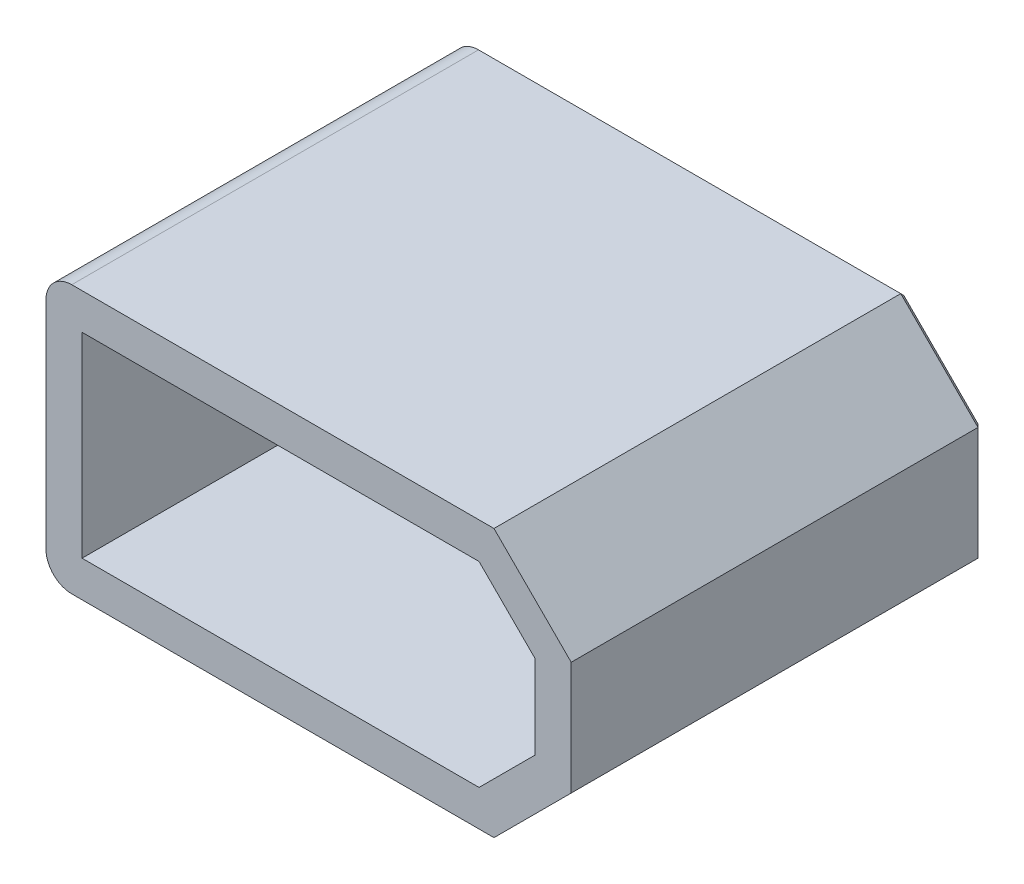
ISO-10303-21;
HEADER;
FILE_DESCRIPTION(('STEP AP214'),'2;1');
FILE_NAME('part.step','',(''),(''),'','','');
FILE_SCHEMA(('AUTOMOTIVE_DESIGN { 1 0 10303 214 1 1 1 1 }'));
ENDSEC;
DATA;
#1=APPLICATION_CONTEXT('core data for automotive mechanical design processes');
#2=APPLICATION_PROTOCOL_DEFINITION('international standard','automotive_design',2000,#1);
#3=PRODUCT_CONTEXT('',#1,'mechanical');
#4=PRODUCT('Part','Part','',(#3));
#5=PRODUCT_RELATED_PRODUCT_CATEGORY('part','',(#4));
#6=PRODUCT_DEFINITION_FORMATION('','',#4);
#7=PRODUCT_DEFINITION_CONTEXT('part definition',#1,'design');
#8=PRODUCT_DEFINITION('design','',#6,#7);
#9=PRODUCT_DEFINITION_SHAPE('','',#8);
#10=(LENGTH_UNIT() NAMED_UNIT(*) SI_UNIT(.MILLI.,.METRE.));
#11=(NAMED_UNIT(*) PLANE_ANGLE_UNIT() SI_UNIT($,.RADIAN.));
#12=(NAMED_UNIT(*) SI_UNIT($,.STERADIAN.) SOLID_ANGLE_UNIT());
#13=UNCERTAINTY_MEASURE_WITH_UNIT(LENGTH_MEASURE(1.E-05),#10,'distance_accuracy_value','');
#14=(GEOMETRIC_REPRESENTATION_CONTEXT(3) GLOBAL_UNCERTAINTY_ASSIGNED_CONTEXT((#13)) GLOBAL_UNIT_ASSIGNED_CONTEXT((#10,
#11,#12)) REPRESENTATION_CONTEXT('',''));
#15=CARTESIAN_POINT('',(0.,0.,0.));
#16=DIRECTION('',(0.,0.,1.));
#17=DIRECTION('',(1.,0.,0.));
#18=AXIS2_PLACEMENT_3D('',#15,#16,#17);
#19=CARTESIAN_POINT('',(-2.5,0.,4.3));
#20=DIRECTION('',(0.,0.,1.));
#21=DIRECTION('',(1.,0.,0.));
#22=AXIS2_PLACEMENT_3D('',#19,#20,#21);
#23=PLANE('',#22);
#24=CARTESIAN_POINT('',(-2.5,0.,4.30000000000064));
#25=DIRECTION('',(0.,0.,-1.));
#26=DIRECTION('',(-1.,0.,0.));
#27=AXIS2_PLACEMENT_3D('',#24,#25,#26);
#28=CIRCLE('',#27,0.899999999942338);
#29=CARTESIAN_POINT('',(-3.39999999994234,0.,4.30000000000064));
#30=VERTEX_POINT('',#29);
#31=EDGE_CURVE('E20',#30,#30,#28,.T.);
#32=ORIENTED_EDGE('',*,*,#31,.F.);
#33=EDGE_LOOP('',(#32));
#34=FACE_BOUND('',#33,.T.);
#35=ADVANCED_FACE('F17',(#34),#23,.T.);
#36=CARTESIAN_POINT('',(2.5,0.,4.3));
#37=DIRECTION('',(0.,0.,1.));
#38=DIRECTION('',(1.,0.,0.));
#39=AXIS2_PLACEMENT_3D('',#36,#37,#38);
#40=PLANE('',#39);
#41=CARTESIAN_POINT('',(2.5,0.,4.30000000005748));
#42=DIRECTION('',(0.,0.,-1.));
#43=DIRECTION('',(-1.,0.,0.));
#44=AXIS2_PLACEMENT_3D('',#41,#42,#43);
#45=CIRCLE('',#44,0.899999999946886);
#46=CARTESIAN_POINT('',(1.60000000005311,0.,4.30000000005748));
#47=VERTEX_POINT('',#46);
#48=EDGE_CURVE('E362',#47,#47,#45,.T.);
#49=ORIENTED_EDGE('',*,*,#48,.F.);
#50=EDGE_LOOP('',(#49));
#51=FACE_BOUND('',#50,.T.);
#52=ADVANCED_FACE('F378',(#51),#40,.T.);
#53=CARTESIAN_POINT('',(-2.5,0.,4.20000000002574));
#54=DIRECTION('',(0.,0.,-1.));
#55=DIRECTION('',(-1.,0.,0.));
#56=AXIS2_PLACEMENT_3D('',#53,#54,#55);
#57=CONICAL_SURFACE('',#56,0.999999999917236,0.785398163397448);
#58=CARTESIAN_POINT('',(-2.5,0.,4.2));
#59=DIRECTION('',(0.,0.,-1.));
#60=DIRECTION('',(-1.,0.,0.));
#61=AXIS2_PLACEMENT_3D('',#58,#59,#60);
#62=CIRCLE('',#61,1.);
#63=CARTESIAN_POINT('',(-3.5,0.,4.2));
#64=VERTEX_POINT('',#63);
#65=EDGE_CURVE('E359',#64,#64,#62,.T.);
#66=ORIENTED_EDGE('',*,*,#65,.F.);
#67=EDGE_LOOP('',(#66));
#68=FACE_BOUND('',#67,.T.);
#69=ORIENTED_EDGE('',*,*,#31,.T.);
#70=EDGE_LOOP('',(#69));
#71=FACE_BOUND('',#70,.T.);
#72=ADVANCED_FACE('F375',(#68,#71),#57,.T.);
#73=CARTESIAN_POINT('',(2.5,0.,4.20000000002574));
#74=DIRECTION('',(0.,0.,-1.));
#75=DIRECTION('',(-1.,0.,0.));
#76=AXIS2_PLACEMENT_3D('',#73,#74,#75);
#77=CONICAL_SURFACE('',#76,0.999999999978627,0.785398163397448);
#78=CARTESIAN_POINT('',(2.5,0.,4.2));
#79=DIRECTION('',(0.,0.,-1.));
#80=DIRECTION('',(-1.,0.,0.));
#81=AXIS2_PLACEMENT_3D('',#78,#79,#80);
#82=CIRCLE('',#81,1.);
#83=CARTESIAN_POINT('',(1.5,0.,4.2));
#84=VERTEX_POINT('',#83);
#85=EDGE_CURVE('E356',#84,#84,#82,.T.);
#86=ORIENTED_EDGE('',*,*,#85,.F.);
#87=EDGE_LOOP('',(#86));
#88=FACE_BOUND('',#87,.T.);
#89=ORIENTED_EDGE('',*,*,#48,.T.);
#90=EDGE_LOOP('',(#89));
#91=FACE_BOUND('',#90,.T.);
#92=ADVANCED_FACE('F488',(#88,#91),#77,.T.);
#93=CARTESIAN_POINT('',(-2.5,0.,4.3));
#94=DIRECTION('',(0.,0.,-1.));
#95=DIRECTION('',(-1.,0.,0.));
#96=AXIS2_PLACEMENT_3D('',#93,#94,#95);
#97=CYLINDRICAL_SURFACE('',#96,1.);
#98=CARTESIAN_POINT('',(-2.5,0.,1.3));
#99=DIRECTION('',(0.,0.,-1.));
#100=DIRECTION('',(-1.,0.,0.));
#101=AXIS2_PLACEMENT_3D('',#98,#99,#100);
#102=CIRCLE('',#101,1.);
#103=CARTESIAN_POINT('',(-3.5,0.,1.3));
#104=VERTEX_POINT('',#103);
#105=EDGE_CURVE('E344',#104,#104,#102,.T.);
#106=ORIENTED_EDGE('',*,*,#105,.F.);
#107=EDGE_LOOP('',(#106));
#108=FACE_BOUND('',#107,.T.);
#109=ORIENTED_EDGE('',*,*,#65,.T.);
#110=EDGE_LOOP('',(#109));
#111=FACE_BOUND('',#110,.T.);
#112=ADVANCED_FACE('F484',(#108,#111),#97,.T.);
#113=CARTESIAN_POINT('',(2.5,0.,4.3));
#114=DIRECTION('',(0.,0.,-1.));
#115=DIRECTION('',(-1.,0.,0.));
#116=AXIS2_PLACEMENT_3D('',#113,#114,#115);
#117=CYLINDRICAL_SURFACE('',#116,1.);
#118=CARTESIAN_POINT('',(2.5,0.,1.3));
#119=DIRECTION('',(0.,0.,-1.));
#120=DIRECTION('',(-1.,0.,0.));
#121=AXIS2_PLACEMENT_3D('',#118,#119,#120);
#122=CIRCLE('',#121,1.);
#123=CARTESIAN_POINT('',(1.5,0.,1.3));
#124=VERTEX_POINT('',#123);
#125=EDGE_CURVE('E339',#124,#124,#122,.T.);
#126=ORIENTED_EDGE('',*,*,#125,.F.);
#127=EDGE_LOOP('',(#126));
#128=FACE_BOUND('',#127,.T.);
#129=ORIENTED_EDGE('',*,*,#85,.T.);
#130=EDGE_LOOP('',(#129));
#131=FACE_BOUND('',#130,.T.);
#132=ADVANCED_FACE('F480',(#128,#131),#117,.T.);
#133=CARTESIAN_POINT('',(4.4,-0.81005050633883,1.3));
#134=DIRECTION('',(1.,0.,0.));
#135=DIRECTION('',(0.,0.,-1.));
#136=AXIS2_PLACEMENT_3D('',#133,#134,#135);
#137=PLANE('',#136);
#138=DIRECTION('',(0.,0.,1.));
#139=VECTOR('',#138,1.);
#140=CARTESIAN_POINT('',(4.4,0.810050506338831,1.3));
#141=LINE('',#140,#139);
#142=CARTESIAN_POINT('',(4.4,0.810050506338831,8.));
#143=VERTEX_POINT('',#142);
#144=CARTESIAN_POINT('',(4.4,0.810050506338831,1.3));
#145=VERTEX_POINT('',#144);
#146=EDGE_CURVE('E348',#143,#145,#141,.F.);
#147=ORIENTED_EDGE('',*,*,#146,.T.);
#148=DIRECTION('',(0.,1.,0.));
#149=VECTOR('',#148,1.);
#150=CARTESIAN_POINT('',(4.4,0.,1.3));
#151=LINE('',#150,#149);
#152=CARTESIAN_POINT('',(4.4,-0.81005050633883,1.3));
#153=VERTEX_POINT('',#152);
#154=EDGE_CURVE('E342',#153,#145,#151,.T.);
#155=ORIENTED_EDGE('',*,*,#154,.F.);
#156=DIRECTION('',(0.,0.,1.));
#157=VECTOR('',#156,1.);
#158=CARTESIAN_POINT('',(4.4,-0.81005050633883,1.3));
#159=LINE('',#158,#157);
#160=CARTESIAN_POINT('',(4.4,-0.81005050633883,8.));
#161=VERTEX_POINT('',#160);
#162=EDGE_CURVE('E333',#153,#161,#159,.T.);
#163=ORIENTED_EDGE('',*,*,#162,.T.);
#164=DIRECTION('',(0.,1.,0.));
#165=VECTOR('',#164,1.);
#166=CARTESIAN_POINT('',(4.4,-0.81005050633883,8.));
#167=LINE('',#166,#165);
#168=EDGE_CURVE('E351',#143,#161,#167,.F.);
#169=ORIENTED_EDGE('',*,*,#168,.F.);
#170=EDGE_LOOP('',(#147,#155,#163,#169));
#171=FACE_BOUND('',#170,.T.);
#172=ADVANCED_FACE('F476',(#171),#137,.F.);
#173=CARTESIAN_POINT('',(4.4,0.810050506338831,1.3));
#174=DIRECTION('',(0.707106781186548,0.707106781186547,0.));
#175=DIRECTION('',(-0.707106781186547,0.707106781186548,0.));
#176=AXIS2_PLACEMENT_3D('',#173,#174,#175);
#177=PLANE('',#176);
#178=DIRECTION('',(0.,0.,1.));
#179=VECTOR('',#178,1.);
#180=CARTESIAN_POINT('',(3.31005050633883,1.9,1.3));
#181=LINE('',#180,#179);
#182=CARTESIAN_POINT('',(3.31005050633883,1.9,8.));
#183=VERTEX_POINT('',#182);
#184=CARTESIAN_POINT('',(3.31005050633883,1.9,1.3));
#185=VERTEX_POINT('',#184);
#186=EDGE_CURVE('E289',#183,#185,#181,.F.);
#187=ORIENTED_EDGE('',*,*,#186,.T.);
#188=DIRECTION('',(-0.707106781186547,0.707106781186548,0.));
#189=VECTOR('',#188,1.);
#190=CARTESIAN_POINT('',(4.4,0.810050506338831,1.3));
#191=LINE('',#190,#189);
#192=EDGE_CURVE('E340',#145,#185,#191,.T.);
#193=ORIENTED_EDGE('',*,*,#192,.F.);
#194=ORIENTED_EDGE('',*,*,#146,.F.);
#195=DIRECTION('',(-0.707106781186547,0.707106781186548,0.));
#196=VECTOR('',#195,1.);
#197=CARTESIAN_POINT('',(4.4,0.810050506338831,8.));
#198=LINE('',#197,#196);
#199=EDGE_CURVE('E345',#183,#143,#198,.F.);
#200=ORIENTED_EDGE('',*,*,#199,.F.);
#201=EDGE_LOOP('',(#187,#193,#194,#200));
#202=FACE_BOUND('',#201,.T.);
#203=ADVANCED_FACE('F472',(#202),#177,.F.);
#204=CARTESIAN_POINT('',(0.,0.,1.3));
#205=DIRECTION('',(0.,0.,1.));
#206=DIRECTION('',(1.,0.,0.));
#207=AXIS2_PLACEMENT_3D('',#204,#205,#206);
#208=PLANE('',#207);
#209=ORIENTED_EDGE('',*,*,#125,.T.);
#210=EDGE_LOOP('',(#209));
#211=FACE_BOUND('',#210,.T.);
#212=ORIENTED_EDGE('',*,*,#192,.T.);
#213=DIRECTION('',(1.,0.,0.));
#214=VECTOR('',#213,1.);
#215=CARTESIAN_POINT('',(3.31005050633883,1.9,1.3));
#216=LINE('',#215,#214);
#217=CARTESIAN_POINT('',(-4.4,1.9,1.3));
#218=VERTEX_POINT('',#217);
#219=EDGE_CURVE('E287',#185,#218,#216,.F.);
#220=ORIENTED_EDGE('',*,*,#219,.T.);
#221=DIRECTION('',(0.,1.,0.));
#222=VECTOR('',#221,1.);
#223=CARTESIAN_POINT('',(-4.4,1.9,1.3));
#224=LINE('',#223,#222);
#225=CARTESIAN_POINT('',(-4.4,-1.9,1.3));
#226=VERTEX_POINT('',#225);
#227=EDGE_CURVE('E282',#218,#226,#224,.F.);
#228=ORIENTED_EDGE('',*,*,#227,.T.);
#229=DIRECTION('',(1.,0.,0.));
#230=VECTOR('',#229,1.);
#231=CARTESIAN_POINT('',(-4.4,-1.9,1.3));
#232=LINE('',#231,#230);
#233=CARTESIAN_POINT('',(3.31005050633883,-1.9,1.3));
#234=VERTEX_POINT('',#233);
#235=EDGE_CURVE('E276',#226,#234,#232,.T.);
#236=ORIENTED_EDGE('',*,*,#235,.T.);
#237=DIRECTION('',(0.707106781186548,0.707106781186547,0.));
#238=VECTOR('',#237,1.);
#239=CARTESIAN_POINT('',(3.31005050633883,-1.9,1.3));
#240=LINE('',#239,#238);
#241=EDGE_CURVE('E336',#234,#153,#240,.T.);
#242=ORIENTED_EDGE('',*,*,#241,.T.);
#243=ORIENTED_EDGE('',*,*,#154,.T.);
#244=EDGE_LOOP('',(#212,#220,#228,#236,#242,#243));
#245=FACE_BOUND('',#244,.T.);
#246=ORIENTED_EDGE('',*,*,#105,.T.);
#247=EDGE_LOOP('',(#246));
#248=FACE_BOUND('',#247,.T.);
#249=ADVANCED_FACE('F468',(#211,#245,#248),#208,.T.);
#250=CARTESIAN_POINT('',(3.31005050633883,-1.9,1.3));
#251=DIRECTION('',(0.707106781186547,-0.707106781186548,0.));
#252=DIRECTION('',(0.707106781186548,0.707106781186547,0.));
#253=AXIS2_PLACEMENT_3D('',#250,#251,#252);
#254=PLANE('',#253);
#255=ORIENTED_EDGE('',*,*,#162,.F.);
#256=ORIENTED_EDGE('',*,*,#241,.F.);
#257=DIRECTION('',(0.,0.,-1.));
#258=VECTOR('',#257,1.);
#259=CARTESIAN_POINT('',(3.31005050633883,-1.9,1.3));
#260=LINE('',#259,#258);
#261=CARTESIAN_POINT('',(3.31005050633883,-1.9,8.));
#262=VERTEX_POINT('',#261);
#263=EDGE_CURVE('E273',#234,#262,#260,.F.);
#264=ORIENTED_EDGE('',*,*,#263,.T.);
#265=DIRECTION('',(0.707106781186548,0.707106781186547,0.));
#266=VECTOR('',#265,1.);
#267=CARTESIAN_POINT('',(3.31005050633883,-1.9,8.));
#268=LINE('',#267,#266);
#269=EDGE_CURVE('E142',#161,#262,#268,.F.);
#270=ORIENTED_EDGE('',*,*,#269,.F.);
#271=EDGE_LOOP('',(#255,#256,#264,#270));
#272=FACE_BOUND('',#271,.T.);
#273=ADVANCED_FACE('F465',(#272),#254,.F.);
#274=CARTESIAN_POINT('',(-4.6,-2.1,8.));
#275=DIRECTION('',(0.,0.,-1.));
#276=DIRECTION('',(-1.,0.,0.));
#277=AXIS2_PLACEMENT_3D('',#274,#275,#276);
#278=CYLINDRICAL_SURFACE('',#277,0.5);
#279=DIRECTION('',(0.,0.,1.));
#280=VECTOR('',#279,1.);
#281=CARTESIAN_POINT('',(-4.6,-2.6,8.));
#282=LINE('',#281,#280);
#283=CARTESIAN_POINT('',(-4.6,-2.59999999999466,0.0999999999874487));
#284=VERTEX_POINT('',#283);
#285=CARTESIAN_POINT('',(-4.6,-2.6,8.));
#286=VERTEX_POINT('',#285);
#287=EDGE_CURVE('E139',#284,#286,#282,.T.);
#288=ORIENTED_EDGE('',*,*,#287,.T.);
#289=CARTESIAN_POINT('',(-4.6,-2.1,8.));
#290=DIRECTION('',(0.,0.,-1.));
#291=DIRECTION('',(-1.,0.,0.));
#292=AXIS2_PLACEMENT_3D('',#289,#290,#291);
#293=CIRCLE('',#292,0.5);
#294=CARTESIAN_POINT('',(-5.1,-2.1,8.));
#295=VERTEX_POINT('',#294);
#296=EDGE_CURVE('E130',#286,#295,#293,.T.);
#297=ORIENTED_EDGE('',*,*,#296,.T.);
#298=DIRECTION('',(0.,0.,-1.));
#299=VECTOR('',#298,1.);
#300=CARTESIAN_POINT('',(-5.1,-2.1,8.));
#301=LINE('',#300,#299);
#302=CARTESIAN_POINT('',(-5.1000000000015,-2.1,0.100000000007935));
#303=VERTEX_POINT('',#302);
#304=EDGE_CURVE('E137',#295,#303,#301,.T.);
#305=ORIENTED_EDGE('',*,*,#304,.T.);
#306=CARTESIAN_POINT('',(-4.6,-2.1,0.100000000031741));
#307=DIRECTION('',(0.,0.,1.));
#308=DIRECTION('',(1.,0.,0.));
#309=AXIS2_PLACEMENT_3D('',#306,#307,#308);
#310=CIRCLE('',#309,0.500000000006003);
#311=EDGE_CURVE('E314',#284,#303,#310,.F.);
#312=ORIENTED_EDGE('',*,*,#311,.F.);
#313=EDGE_LOOP('',(#288,#297,#305,#312));
#314=FACE_BOUND('',#313,.T.);
#315=ADVANCED_FACE('F135',(#314),#278,.T.);
#316=CARTESIAN_POINT('',(3.02928932188134,-3.02928932188134,0.));
#317=DIRECTION('',(0.499999999999995,-0.499999999999996,-0.707106781186554));
#318=DIRECTION('',(0.,0.816496580927731,-0.577350269189619));
#319=AXIS2_PLACEMENT_3D('',#316,#317,#318);
#320=PLANE('',#319);
#321=DIRECTION('',(0.281084637714824,-0.678598344545852,0.678598344545841));
#322=VECTOR('',#321,1.);
#323=CARTESIAN_POINT('',(3.55857864376268,-2.5,0.));
#324=LINE('',#323,#322);
#325=CARTESIAN_POINT('',(3.55857864376268,-2.5,0.));
#326=VERTEX_POINT('',#325);
#327=CARTESIAN_POINT('',(3.59999999999999,-2.6,0.0999999999999994));
#328=VERTEX_POINT('',#327);
#329=EDGE_CURVE('E141',#326,#328,#324,.T.);
#330=ORIENTED_EDGE('',*,*,#329,.F.);
#331=DIRECTION('',(-0.707106781186548,-0.707106781186547,0.));
#332=VECTOR('',#331,1.);
#333=CARTESIAN_POINT('',(5.,-1.05857864376269,0.));
#334=LINE('',#333,#332);
#335=CARTESIAN_POINT('',(5.,-1.05857864376269,0.));
#336=VERTEX_POINT('',#335);
#337=EDGE_CURVE('E212',#336,#326,#334,.T.);
#338=ORIENTED_EDGE('',*,*,#337,.F.);
#339=DIRECTION('',(-0.678598344545852,0.281084637714825,-0.67859834454584));
#340=VECTOR('',#339,1.);
#341=CARTESIAN_POINT('',(5.1,-1.1,0.0999999999999994));
#342=LINE('',#341,#340);
#343=CARTESIAN_POINT('',(5.1,-1.1,0.0999999999999994));
#344=VERTEX_POINT('',#343);
#345=EDGE_CURVE('E292',#344,#336,#342,.T.);
#346=ORIENTED_EDGE('',*,*,#345,.F.);
#347=DIRECTION('',(-0.707106781186548,-0.707106781186547,0.));
#348=VECTOR('',#347,1.);
#349=CARTESIAN_POINT('',(5.1,-1.1,0.0999999999999994));
#350=LINE('',#349,#348);
#351=EDGE_CURVE('E263',#344,#328,#350,.T.);
#352=ORIENTED_EDGE('',*,*,#351,.T.);
#353=EDGE_LOOP('',(#330,#338,#346,#352));
#354=FACE_BOUND('',#353,.T.);
#355=ADVANCED_FACE('F458',(#354),#320,.T.);
#356=CARTESIAN_POINT('',(-5.1,-2.6,0.0999999999999994));
#357=DIRECTION('',(0.,-0.707106781186541,-0.707106781186554));
#358=DIRECTION('',(0.,0.707106781186554,-0.707106781186541));
#359=AXIS2_PLACEMENT_3D('',#356,#357,#358);
#360=PLANE('',#359);
#361=ORIENTED_EDGE('',*,*,#329,.T.);
#362=DIRECTION('',(1.,0.,0.));
#363=VECTOR('',#362,1.);
#364=CARTESIAN_POINT('',(-5.1,-2.6,0.0999999999999994));
#365=LINE('',#364,#363);
#366=EDGE_CURVE('E257',#328,#284,#365,.F.);
#367=ORIENTED_EDGE('',*,*,#366,.T.);
#368=DIRECTION('',(0.,0.707106781186554,-0.707106781186541));
#369=VECTOR('',#368,1.);
#370=CARTESIAN_POINT('',(-4.60000000009166,-499002.500000009,499000.));
#371=LINE('',#370,#369);
#372=CARTESIAN_POINT('',(-4.6,-2.5000000000487,5.29785227189675E-12));
#373=VERTEX_POINT('',#372);
#374=EDGE_CURVE('E317',#373,#284,#371,.F.);
#375=ORIENTED_EDGE('',*,*,#374,.F.);
#376=DIRECTION('',(-1.,0.,0.));
#377=VECTOR('',#376,1.);
#378=CARTESIAN_POINT('',(0.,-2.5,0.));
#379=LINE('',#378,#377);
#380=EDGE_CURVE('E210',#326,#373,#379,.T.);
#381=ORIENTED_EDGE('',*,*,#380,.F.);
#382=EDGE_LOOP('',(#361,#367,#375,#381));
#383=FACE_BOUND('',#382,.T.);
#384=ADVANCED_FACE('F454',(#383),#360,.T.);
#385=CARTESIAN_POINT('',(-4.6,-2.1,0.0999999999180545));
#386=DIRECTION('',(0.,0.,1.));
#387=DIRECTION('',(1.,0.,0.));
#388=AXIS2_PLACEMENT_3D('',#385,#386,#387);
#389=CONICAL_SURFACE('',#388,0.499999999949159,0.785398163681665);
#390=ORIENTED_EDGE('',*,*,#374,.T.);
#391=ORIENTED_EDGE('',*,*,#311,.T.);
#392=DIRECTION('',(-0.707106781186554,0.,0.707106781186541));
#393=VECTOR('',#392,1.);
#394=CARTESIAN_POINT('',(-5.1,-2.1,0.0999999999999994));
#395=LINE('',#394,#393);
#396=CARTESIAN_POINT('',(-5.00000000001951,-2.1,1.9508703598967E-11));
#397=VERTEX_POINT('',#396);
#398=EDGE_CURVE('E302',#397,#303,#395,.T.);
#399=ORIENTED_EDGE('',*,*,#398,.F.);
#400=CARTESIAN_POINT('',(-4.6,-2.1,3.90174139741975E-11));
#401=DIRECTION('',(0.,0.,1.));
#402=DIRECTION('',(1.,0.,0.));
#403=AXIS2_PLACEMENT_3D('',#400,#401,#402);
#404=CIRCLE('',#403,0.400000000013279);
#405=EDGE_CURVE('E209',#373,#397,#404,.F.);
#406=ORIENTED_EDGE('',*,*,#405,.F.);
#407=EDGE_LOOP('',(#390,#391,#399,#406));
#408=FACE_BOUND('',#407,.T.);
#409=ADVANCED_FACE('F450',(#408),#389,.T.);
#410=CARTESIAN_POINT('',(-5.1,-2.6,0.0999999999999994));
#411=DIRECTION('',(-0.707106781186541,0.,-0.707106781186554));
#412=DIRECTION('',(-0.707106781186554,0.,0.707106781186541));
#413=AXIS2_PLACEMENT_3D('',#410,#411,#412);
#414=PLANE('',#413);
#415=ORIENTED_EDGE('',*,*,#398,.T.);
#416=DIRECTION('',(0.,1.,0.));
#417=VECTOR('',#416,1.);
#418=CARTESIAN_POINT('',(-5.1,-2.6,0.0999999999999994));
#419=LINE('',#418,#417);
#420=CARTESIAN_POINT('',(-5.09999999999259,2.1,0.099999999993724));
#421=VERTEX_POINT('',#420);
#422=EDGE_CURVE('E152',#303,#421,#419,.T.);
#423=ORIENTED_EDGE('',*,*,#422,.T.);
#424=DIRECTION('',(0.707106781186555,0.,-0.70710678118654));
#425=VECTOR('',#424,1.);
#426=CARTESIAN_POINT('',(-499005.000000011,2.10000000006111,499000.));
#427=LINE('',#426,#425);
#428=CARTESIAN_POINT('',(-5.0000000000055,2.1,0.));
#429=VERTEX_POINT('',#428);
#430=EDGE_CURVE('E247',#429,#421,#427,.F.);
#431=ORIENTED_EDGE('',*,*,#430,.F.);
#432=DIRECTION('',(0.,1.,0.));
#433=VECTOR('',#432,1.);
#434=CARTESIAN_POINT('',(-5.,0.,0.));
#435=LINE('',#434,#433);
#436=EDGE_CURVE('E206',#397,#429,#435,.T.);
#437=ORIENTED_EDGE('',*,*,#436,.F.);
#438=EDGE_LOOP('',(#415,#423,#431,#437));
#439=FACE_BOUND('',#438,.T.);
#440=ADVANCED_FACE('F446',(#439),#414,.T.);
#441=CARTESIAN_POINT('',(5.1,-2.6,0.0999999999999994));
#442=DIRECTION('',(0.707106781186541,0.,-0.707106781186554));
#443=DIRECTION('',(-0.707106781186554,0.,-0.707106781186541));
#444=AXIS2_PLACEMENT_3D('',#441,#442,#443);
#445=PLANE('',#444);
#446=ORIENTED_EDGE('',*,*,#345,.T.);
#447=DIRECTION('',(0.,1.,0.));
#448=VECTOR('',#447,1.);
#449=CARTESIAN_POINT('',(5.,0.,0.));
#450=LINE('',#449,#448);
#451=CARTESIAN_POINT('',(5.,1.05857864376269,0.));
#452=VERTEX_POINT('',#451);
#453=EDGE_CURVE('E251',#452,#336,#450,.F.);
#454=ORIENTED_EDGE('',*,*,#453,.F.);
#455=DIRECTION('',(-0.678598344545853,-0.281084637714819,-0.678598344545841));
#456=VECTOR('',#455,1.);
#457=CARTESIAN_POINT('',(5.1,1.1,0.0999999999999995));
#458=LINE('',#457,#456);
#459=CARTESIAN_POINT('',(5.1,1.1,0.0999999999999994));
#460=VERTEX_POINT('',#459);
#461=EDGE_CURVE('E231',#460,#452,#458,.T.);
#462=ORIENTED_EDGE('',*,*,#461,.F.);
#463=DIRECTION('',(0.,1.,0.));
#464=VECTOR('',#463,1.);
#465=CARTESIAN_POINT('',(5.1,-2.6,0.0999999999999994));
#466=LINE('',#465,#464);
#467=EDGE_CURVE('E230',#460,#344,#466,.F.);
#468=ORIENTED_EDGE('',*,*,#467,.T.);
#469=EDGE_LOOP('',(#446,#454,#462,#468));
#470=FACE_BOUND('',#469,.T.);
#471=ADVANCED_FACE('F442',(#470),#445,.T.);
#472=CARTESIAN_POINT('',(3.31005050633883,1.9,1.3));
#473=DIRECTION('',(0.,1.,0.));
#474=DIRECTION('',(0.,0.,1.));
#475=AXIS2_PLACEMENT_3D('',#472,#473,#474);
#476=PLANE('',#475);
#477=DIRECTION('',(0.,0.,1.));
#478=VECTOR('',#477,1.);
#479=CARTESIAN_POINT('',(-4.4,1.9,1.3));
#480=LINE('',#479,#478);
#481=CARTESIAN_POINT('',(-4.4,1.9,8.));
#482=VERTEX_POINT('',#481);
#483=EDGE_CURVE('E284',#482,#218,#480,.F.);
#484=ORIENTED_EDGE('',*,*,#483,.T.);
#485=ORIENTED_EDGE('',*,*,#219,.F.);
#486=ORIENTED_EDGE('',*,*,#186,.F.);
#487=DIRECTION('',(-1.,0.,0.));
#488=VECTOR('',#487,1.);
#489=CARTESIAN_POINT('',(0.,1.9,8.));
#490=LINE('',#489,#488);
#491=EDGE_CURVE('E176',#183,#482,#490,.T.);
#492=ORIENTED_EDGE('',*,*,#491,.T.);
#493=EDGE_LOOP('',(#484,#485,#486,#492));
#494=FACE_BOUND('',#493,.T.);
#495=ADVANCED_FACE('F438',(#494),#476,.F.);
#496=CARTESIAN_POINT('',(-4.4,1.9,1.3));
#497=DIRECTION('',(-1.,0.,0.));
#498=DIRECTION('',(0.,0.,1.));
#499=AXIS2_PLACEMENT_3D('',#496,#497,#498);
#500=PLANE('',#499);
#501=DIRECTION('',(0.,0.,-1.));
#502=VECTOR('',#501,1.);
#503=CARTESIAN_POINT('',(-4.4,-1.9,1.3));
#504=LINE('',#503,#502);
#505=CARTESIAN_POINT('',(-4.4,-1.9,8.));
#506=VERTEX_POINT('',#505);
#507=EDGE_CURVE('E279',#506,#226,#504,.T.);
#508=ORIENTED_EDGE('',*,*,#507,.T.);
#509=ORIENTED_EDGE('',*,*,#227,.F.);
#510=ORIENTED_EDGE('',*,*,#483,.F.);
#511=DIRECTION('',(0.,1.,0.));
#512=VECTOR('',#511,1.);
#513=CARTESIAN_POINT('',(-4.4,0.,8.));
#514=LINE('',#513,#512);
#515=EDGE_CURVE('E173',#482,#506,#514,.F.);
#516=ORIENTED_EDGE('',*,*,#515,.T.);
#517=EDGE_LOOP('',(#508,#509,#510,#516));
#518=FACE_BOUND('',#517,.T.);
#519=ADVANCED_FACE('F434',(#518),#500,.F.);
#520=CARTESIAN_POINT('',(-4.4,-1.9,1.3));
#521=DIRECTION('',(0.,-1.,0.));
#522=DIRECTION('',(0.,0.,-1.));
#523=AXIS2_PLACEMENT_3D('',#520,#521,#522);
#524=PLANE('',#523);
#525=ORIENTED_EDGE('',*,*,#263,.F.);
#526=ORIENTED_EDGE('',*,*,#235,.F.);
#527=ORIENTED_EDGE('',*,*,#507,.F.);
#528=DIRECTION('',(-1.,0.,0.));
#529=VECTOR('',#528,1.);
#530=CARTESIAN_POINT('',(0.,-1.9,8.));
#531=LINE('',#530,#529);
#532=EDGE_CURVE('E169',#506,#262,#531,.F.);
#533=ORIENTED_EDGE('',*,*,#532,.T.);
#534=EDGE_LOOP('',(#525,#526,#527,#533));
#535=FACE_BOUND('',#534,.T.);
#536=ADVANCED_FACE('F430',(#535),#524,.F.);
#537=CARTESIAN_POINT('',(5.1,-1.1,8.));
#538=DIRECTION('',(-0.707106781186547,0.707106781186548,0.));
#539=DIRECTION('',(-0.707106781186548,-0.707106781186547,0.));
#540=AXIS2_PLACEMENT_3D('',#537,#538,#539);
#541=PLANE('',#540);
#542=ORIENTED_EDGE('',*,*,#351,.F.);
#543=DIRECTION('',(0.,0.,1.));
#544=VECTOR('',#543,1.);
#545=CARTESIAN_POINT('',(5.1,-1.1,8.));
#546=LINE('',#545,#544);
#547=CARTESIAN_POINT('',(5.1,-1.1,8.));
#548=VERTEX_POINT('',#547);
#549=EDGE_CURVE('E179',#344,#548,#546,.T.);
#550=ORIENTED_EDGE('',*,*,#549,.T.);
#551=DIRECTION('',(-0.707106781186548,-0.707106781186547,0.));
#552=VECTOR('',#551,1.);
#553=CARTESIAN_POINT('',(5.1,-1.1,8.));
#554=LINE('',#553,#552);
#555=CARTESIAN_POINT('',(3.6,-2.6,8.));
#556=VERTEX_POINT('',#555);
#557=EDGE_CURVE('E164',#548,#556,#554,.T.);
#558=ORIENTED_EDGE('',*,*,#557,.T.);
#559=DIRECTION('',(0.,0.,1.));
#560=VECTOR('',#559,1.);
#561=CARTESIAN_POINT('',(3.59999999999999,-2.6,8.));
#562=LINE('',#561,#560);
#563=EDGE_CURVE('E260',#556,#328,#562,.F.);
#564=ORIENTED_EDGE('',*,*,#563,.T.);
#565=EDGE_LOOP('',(#542,#550,#558,#564));
#566=FACE_BOUND('',#565,.T.);
#567=ADVANCED_FACE('F426',(#566),#541,.F.);
#568=CARTESIAN_POINT('',(-5.1,-2.6,8.));
#569=DIRECTION('',(0.,1.,0.));
#570=DIRECTION('',(0.,0.,1.));
#571=AXIS2_PLACEMENT_3D('',#568,#569,#570);
#572=PLANE('',#571);
#573=ORIENTED_EDGE('',*,*,#366,.F.);
#574=ORIENTED_EDGE('',*,*,#563,.F.);
#575=DIRECTION('',(-1.,0.,0.));
#576=VECTOR('',#575,1.);
#577=CARTESIAN_POINT('',(0.,-2.6,8.));
#578=LINE('',#577,#576);
#579=EDGE_CURVE('E159',#556,#286,#578,.T.);
#580=ORIENTED_EDGE('',*,*,#579,.T.);
#581=ORIENTED_EDGE('',*,*,#287,.F.);
#582=EDGE_LOOP('',(#573,#574,#580,#581));
#583=FACE_BOUND('',#582,.T.);
#584=ADVANCED_FACE('F423',(#583),#572,.F.);
#585=CARTESIAN_POINT('',(-5.1,-2.6,8.));
#586=DIRECTION('',(1.,0.,0.));
#587=DIRECTION('',(0.,0.,-1.));
#588=AXIS2_PLACEMENT_3D('',#585,#586,#587);
#589=PLANE('',#588);
#590=ORIENTED_EDGE('',*,*,#422,.F.);
#591=ORIENTED_EDGE('',*,*,#304,.F.);
#592=DIRECTION('',(0.,1.,0.));
#593=VECTOR('',#592,1.);
#594=CARTESIAN_POINT('',(-5.1,0.,8.));
#595=LINE('',#594,#593);
#596=CARTESIAN_POINT('',(-5.1,2.1,8.));
#597=VERTEX_POINT('',#596);
#598=EDGE_CURVE('E149',#295,#597,#595,.T.);
#599=ORIENTED_EDGE('',*,*,#598,.T.);
#600=DIRECTION('',(0.,0.,-1.));
#601=VECTOR('',#600,1.);
#602=CARTESIAN_POINT('',(-5.1,2.1,8.));
#603=LINE('',#602,#601);
#604=EDGE_CURVE('E162',#421,#597,#603,.F.);
#605=ORIENTED_EDGE('',*,*,#604,.F.);
#606=EDGE_LOOP('',(#590,#591,#599,#605));
#607=FACE_BOUND('',#606,.T.);
#608=ADVANCED_FACE('F147',(#607),#589,.F.);
#609=CARTESIAN_POINT('',(-4.6,2.1,0.100000000145428));
#610=DIRECTION('',(0.,0.,1.));
#611=DIRECTION('',(0.,-1.,0.));
#612=AXIS2_PLACEMENT_3D('',#609,#610,#611);
#613=CONICAL_SURFACE('',#612,0.500000000119689,0.785398163397448);
#614=DIRECTION('',(0.,0.707106781186554,0.707106781186541));
#615=VECTOR('',#614,1.);
#616=CARTESIAN_POINT('',(-4.6,2.6,0.0999999999999994));
#617=LINE('',#616,#615);
#618=CARTESIAN_POINT('',(-4.6,2.50000000002842,2.84217026541404E-11));
#619=VERTEX_POINT('',#618);
#620=CARTESIAN_POINT('',(-4.6,2.6,0.0999999999999994));
#621=VERTEX_POINT('',#620);
#622=EDGE_CURVE('E215',#619,#621,#617,.T.);
#623=ORIENTED_EDGE('',*,*,#622,.F.);
#624=CARTESIAN_POINT('',(-4.6,2.1,5.6843418860808E-11));
#625=DIRECTION('',(0.,0.,1.));
#626=DIRECTION('',(0.,-1.,0.));
#627=AXIS2_PLACEMENT_3D('',#624,#625,#626);
#628=CIRCLE('',#627,0.400000000031105);
#629=EDGE_CURVE('E208',#429,#619,#628,.F.);
#630=ORIENTED_EDGE('',*,*,#629,.F.);
#631=ORIENTED_EDGE('',*,*,#430,.T.);
#632=CARTESIAN_POINT('',(-4.6,2.1,0.0999999999999994));
#633=DIRECTION('',(0.,0.,-1.));
#634=DIRECTION('',(-1.,0.,0.));
#635=AXIS2_PLACEMENT_3D('',#632,#633,#634);
#636=CIRCLE('',#635,0.5);
#637=EDGE_CURVE('E158',#621,#421,#636,.F.);
#638=ORIENTED_EDGE('',*,*,#637,.F.);
#639=EDGE_LOOP('',(#623,#630,#631,#638));
#640=FACE_BOUND('',#639,.T.);
#641=ADVANCED_FACE('F416',(#640),#613,.T.);
#642=CARTESIAN_POINT('',(0.,0.,0.));
#643=DIRECTION('',(0.,0.,-1.));
#644=DIRECTION('',(-1.,0.,0.));
#645=AXIS2_PLACEMENT_3D('',#642,#643,#644);
#646=PLANE('',#645);
#647=DIRECTION('',(1.,0.,0.));
#648=VECTOR('',#647,1.);
#649=CARTESIAN_POINT('',(-5.1,2.5,0.));
#650=LINE('',#649,#648);
#651=CARTESIAN_POINT('',(3.55857864376269,2.5,0.));
#652=VERTEX_POINT('',#651);
#653=EDGE_CURVE('E193',#652,#619,#650,.F.);
#654=ORIENTED_EDGE('',*,*,#653,.F.);
#655=DIRECTION('',(-0.707106781186547,0.707106781186548,0.));
#656=VECTOR('',#655,1.);
#657=CARTESIAN_POINT('',(5.,1.05857864376269,0.));
#658=LINE('',#657,#656);
#659=EDGE_CURVE('E228',#452,#652,#658,.T.);
#660=ORIENTED_EDGE('',*,*,#659,.F.);
#661=ORIENTED_EDGE('',*,*,#453,.T.);
#662=ORIENTED_EDGE('',*,*,#337,.T.);
#663=ORIENTED_EDGE('',*,*,#380,.T.);
#664=ORIENTED_EDGE('',*,*,#405,.T.);
#665=ORIENTED_EDGE('',*,*,#436,.T.);
#666=ORIENTED_EDGE('',*,*,#629,.T.);
#667=EDGE_LOOP('',(#654,#660,#661,#662,#663,#664,#665,#666));
#668=FACE_BOUND('',#667,.T.);
#669=ADVANCED_FACE('F412',(#668),#646,.T.);
#670=CARTESIAN_POINT('',(3.02928932188135,3.02928932188134,0.));
#671=DIRECTION('',(0.499999999999997,0.499999999999996,-0.707106781186553));
#672=DIRECTION('',(-0.81649658092773,0.,-0.57735026918962));
#673=AXIS2_PLACEMENT_3D('',#670,#671,#672);
#674=PLANE('',#673);
#675=ORIENTED_EDGE('',*,*,#461,.T.);
#676=ORIENTED_EDGE('',*,*,#659,.T.);
#677=DIRECTION('',(-0.281084637714814,-0.678598344545854,-0.678598344545843));
#678=VECTOR('',#677,1.);
#679=CARTESIAN_POINT('',(3.6,2.6,0.0999999999999994));
#680=LINE('',#679,#678);
#681=CARTESIAN_POINT('',(3.6,2.6,0.0999999999999994));
#682=VERTEX_POINT('',#681);
#683=EDGE_CURVE('E217',#682,#652,#680,.T.);
#684=ORIENTED_EDGE('',*,*,#683,.F.);
#685=DIRECTION('',(0.707106781186547,-0.707106781186548,0.));
#686=VECTOR('',#685,1.);
#687=CARTESIAN_POINT('',(3.6,2.6,0.0999999999999994));
#688=LINE('',#687,#686);
#689=EDGE_CURVE('E34',#682,#460,#688,.T.);
#690=ORIENTED_EDGE('',*,*,#689,.T.);
#691=EDGE_LOOP('',(#675,#676,#684,#690));
#692=FACE_BOUND('',#691,.T.);
#693=ADVANCED_FACE('F408',(#692),#674,.T.);
#694=CARTESIAN_POINT('',(5.1,-2.6,8.));
#695=DIRECTION('',(-1.,0.,0.));
#696=DIRECTION('',(0.,0.,1.));
#697=AXIS2_PLACEMENT_3D('',#694,#695,#696);
#698=PLANE('',#697);
#699=ORIENTED_EDGE('',*,*,#467,.F.);
#700=DIRECTION('',(0.,0.,1.));
#701=VECTOR('',#700,1.);
#702=CARTESIAN_POINT('',(5.1,1.1,8.));
#703=LINE('',#702,#701);
#704=CARTESIAN_POINT('',(5.1,1.1,8.));
#705=VERTEX_POINT('',#704);
#706=EDGE_CURVE('E187',#460,#705,#703,.T.);
#707=ORIENTED_EDGE('',*,*,#706,.T.);
#708=DIRECTION('',(0.,1.,0.));
#709=VECTOR('',#708,1.);
#710=CARTESIAN_POINT('',(5.1,0.,8.));
#711=LINE('',#710,#709);
#712=EDGE_CURVE('E172',#705,#548,#711,.F.);
#713=ORIENTED_EDGE('',*,*,#712,.T.);
#714=ORIENTED_EDGE('',*,*,#549,.F.);
#715=EDGE_LOOP('',(#699,#707,#713,#714));
#716=FACE_BOUND('',#715,.T.);
#717=ADVANCED_FACE('F405',(#716),#698,.F.);
#718=CARTESIAN_POINT('',(0.,0.,8.));
#719=DIRECTION('',(0.,0.,-1.));
#720=DIRECTION('',(-1.,0.,0.));
#721=AXIS2_PLACEMENT_3D('',#718,#719,#720);
#722=PLANE('',#721);
#723=ORIENTED_EDGE('',*,*,#296,.F.);
#724=ORIENTED_EDGE('',*,*,#579,.F.);
#725=ORIENTED_EDGE('',*,*,#557,.F.);
#726=ORIENTED_EDGE('',*,*,#712,.F.);
#727=DIRECTION('',(0.707106781186547,-0.707106781186548,0.));
#728=VECTOR('',#727,1.);
#729=CARTESIAN_POINT('',(3.6,2.6,8.));
#730=LINE('',#729,#728);
#731=CARTESIAN_POINT('',(3.6,2.6,8.));
#732=VERTEX_POINT('',#731);
#733=EDGE_CURVE('E190',#705,#732,#730,.F.);
#734=ORIENTED_EDGE('',*,*,#733,.T.);
#735=DIRECTION('',(1.,0.,0.));
#736=VECTOR('',#735,1.);
#737=CARTESIAN_POINT('',(-5.1,2.6,8.));
#738=LINE('',#737,#736);
#739=CARTESIAN_POINT('',(-4.6,2.6,8.));
#740=VERTEX_POINT('',#739);
#741=EDGE_CURVE('E183',#732,#740,#738,.F.);
#742=ORIENTED_EDGE('',*,*,#741,.T.);
#743=CARTESIAN_POINT('',(-4.6,2.1,8.));
#744=DIRECTION('',(0.,0.,-1.));
#745=DIRECTION('',(-1.,0.,0.));
#746=AXIS2_PLACEMENT_3D('',#743,#744,#745);
#747=CIRCLE('',#746,0.5);
#748=EDGE_CURVE('E157',#597,#740,#747,.T.);
#749=ORIENTED_EDGE('',*,*,#748,.F.);
#750=ORIENTED_EDGE('',*,*,#598,.F.);
#751=EDGE_LOOP('',(#723,#724,#725,#726,#734,#742,#749,#750));
#752=FACE_BOUND('',#751,.T.);
#753=ORIENTED_EDGE('',*,*,#515,.F.);
#754=ORIENTED_EDGE('',*,*,#491,.F.);
#755=ORIENTED_EDGE('',*,*,#199,.T.);
#756=ORIENTED_EDGE('',*,*,#168,.T.);
#757=ORIENTED_EDGE('',*,*,#269,.T.);
#758=ORIENTED_EDGE('',*,*,#532,.F.);
#759=EDGE_LOOP('',(#753,#754,#755,#756,#757,#758));
#760=FACE_BOUND('',#759,.T.);
#761=ADVANCED_FACE('F154',(#752,#760),#722,.F.);
#762=CARTESIAN_POINT('',(-4.6,2.1,8.));
#763=DIRECTION('',(0.,0.,-1.));
#764=DIRECTION('',(-1.,0.,0.));
#765=AXIS2_PLACEMENT_3D('',#762,#763,#764);
#766=CYLINDRICAL_SURFACE('',#765,0.5);
#767=ORIENTED_EDGE('',*,*,#604,.T.);
#768=ORIENTED_EDGE('',*,*,#748,.T.);
#769=DIRECTION('',(0.,0.,-1.));
#770=VECTOR('',#769,1.);
#771=CARTESIAN_POINT('',(-4.6,2.6,8.));
#772=LINE('',#771,#770);
#773=EDGE_CURVE('E180',#740,#621,#772,.T.);
#774=ORIENTED_EDGE('',*,*,#773,.T.);
#775=ORIENTED_EDGE('',*,*,#637,.T.);
#776=EDGE_LOOP('',(#767,#768,#774,#775));
#777=FACE_BOUND('',#776,.T.);
#778=ADVANCED_FACE('F398',(#777),#766,.T.);
#779=CARTESIAN_POINT('',(-5.1,2.6,0.0999999999999994));
#780=DIRECTION('',(0.,0.707106781186541,-0.707106781186554));
#781=DIRECTION('',(0.,0.707106781186554,0.707106781186541));
#782=AXIS2_PLACEMENT_3D('',#779,#780,#781);
#783=PLANE('',#782);
#784=ORIENTED_EDGE('',*,*,#683,.T.);
#785=ORIENTED_EDGE('',*,*,#653,.T.);
#786=ORIENTED_EDGE('',*,*,#622,.T.);
#787=DIRECTION('',(1.,0.,0.));
#788=VECTOR('',#787,1.);
#789=CARTESIAN_POINT('',(-5.1,2.6,0.0999999999999994));
#790=LINE('',#789,#788);
#791=EDGE_CURVE('E26',#621,#682,#790,.T.);
#792=ORIENTED_EDGE('',*,*,#791,.T.);
#793=EDGE_LOOP('',(#784,#785,#786,#792));
#794=FACE_BOUND('',#793,.T.);
#795=ADVANCED_FACE('F392',(#794),#783,.T.);
#796=CARTESIAN_POINT('',(3.6,2.6,8.));
#797=DIRECTION('',(-0.707106781186548,-0.707106781186547,0.));
#798=DIRECTION('',(0.707106781186547,-0.707106781186548,0.));
#799=AXIS2_PLACEMENT_3D('',#796,#797,#798);
#800=PLANE('',#799);
#801=ORIENTED_EDGE('',*,*,#689,.F.);
#802=DIRECTION('',(0.,0.,-1.));
#803=VECTOR('',#802,1.);
#804=CARTESIAN_POINT('',(3.6,2.6,8.));
#805=LINE('',#804,#803);
#806=EDGE_CURVE('E11',#682,#732,#805,.F.);
#807=ORIENTED_EDGE('',*,*,#806,.T.);
#808=ORIENTED_EDGE('',*,*,#733,.F.);
#809=ORIENTED_EDGE('',*,*,#706,.F.);
#810=EDGE_LOOP('',(#801,#807,#808,#809));
#811=FACE_BOUND('',#810,.T.);
#812=ADVANCED_FACE('F386',(#811),#800,.F.);
#813=CARTESIAN_POINT('',(-5.1,2.6,8.));
#814=DIRECTION('',(0.,-1.,0.));
#815=DIRECTION('',(0.,0.,-1.));
#816=AXIS2_PLACEMENT_3D('',#813,#814,#815);
#817=PLANE('',#816);
#818=ORIENTED_EDGE('',*,*,#791,.F.);
#819=ORIENTED_EDGE('',*,*,#773,.F.);
#820=ORIENTED_EDGE('',*,*,#741,.F.);
#821=ORIENTED_EDGE('',*,*,#806,.F.);
#822=EDGE_LOOP('',(#818,#819,#820,#821));
#823=FACE_BOUND('',#822,.T.);
#824=ADVANCED_FACE('F384',(#823),#817,.F.);
#825=CLOSED_SHELL('',(#35,#52,#72,#92,#112,#132,#172,#203,#249,#273,#315,#355,#384,#409,#440,
#471,#495,#519,#536,#567,#584,#608,#641,#669,#693,#717,#761,#778,#795,#812,#824));
#826=MANIFOLD_SOLID_BREP('B1',#825);
#827=ADVANCED_BREP_SHAPE_REPRESENTATION('',(#18,#826),#14);
#828=SHAPE_DEFINITION_REPRESENTATION(#9,#827);
ENDSEC;
END-ISO-10303-21;
